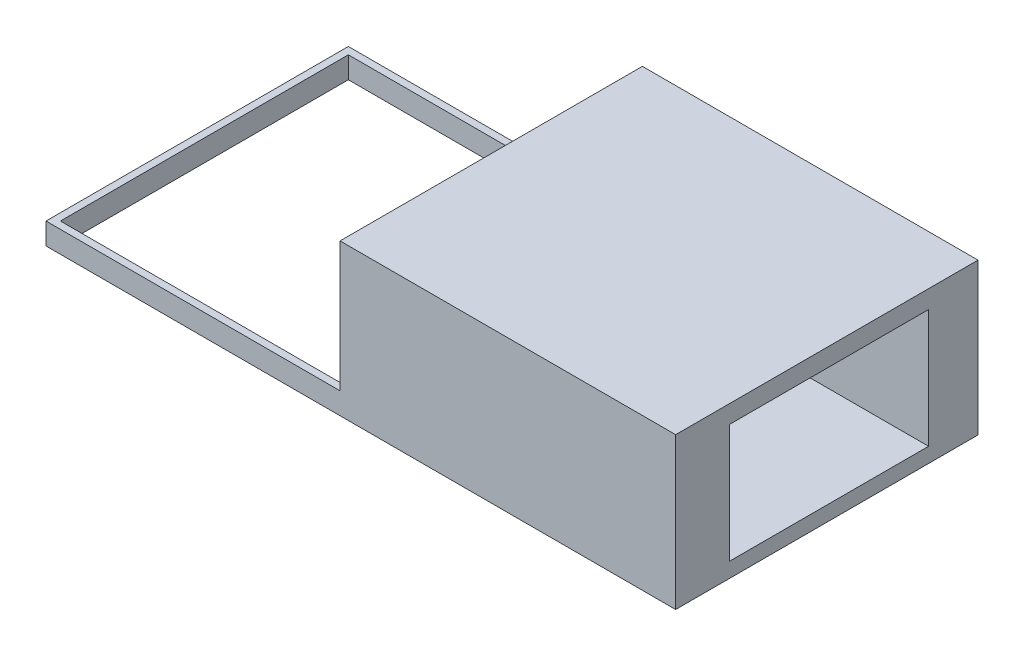
ISO-10303-21;
HEADER;
FILE_DESCRIPTION(('STEP AP214'),'2;1');
FILE_NAME('part.step','',(''),(''),'','','');
FILE_SCHEMA(('AUTOMOTIVE_DESIGN { 1 0 10303 214 1 1 1 1 }'));
ENDSEC;
DATA;
#1=APPLICATION_CONTEXT('core data for automotive mechanical design processes');
#2=APPLICATION_PROTOCOL_DEFINITION('international standard','automotive_design',2000,#1);
#3=PRODUCT_CONTEXT('',#1,'mechanical');
#4=PRODUCT('Part','Part','',(#3));
#5=PRODUCT_RELATED_PRODUCT_CATEGORY('part','',(#4));
#6=PRODUCT_DEFINITION_FORMATION('','',#4);
#7=PRODUCT_DEFINITION_CONTEXT('part definition',#1,'design');
#8=PRODUCT_DEFINITION('design','',#6,#7);
#9=PRODUCT_DEFINITION_SHAPE('','',#8);
#10=(LENGTH_UNIT() NAMED_UNIT(*) SI_UNIT(.MILLI.,.METRE.));
#11=(NAMED_UNIT(*) PLANE_ANGLE_UNIT() SI_UNIT($,.RADIAN.));
#12=(NAMED_UNIT(*) SI_UNIT($,.STERADIAN.) SOLID_ANGLE_UNIT());
#13=UNCERTAINTY_MEASURE_WITH_UNIT(LENGTH_MEASURE(1.E-05),#10,'distance_accuracy_value','');
#14=(GEOMETRIC_REPRESENTATION_CONTEXT(3) GLOBAL_UNCERTAINTY_ASSIGNED_CONTEXT((#13)) GLOBAL_UNIT_ASSIGNED_CONTEXT((#10,
#11,#12)) REPRESENTATION_CONTEXT('',''));
#15=CARTESIAN_POINT('',(0.,0.,0.));
#16=DIRECTION('',(0.,0.,1.));
#17=DIRECTION('',(1.,0.,0.));
#18=AXIS2_PLACEMENT_3D('',#15,#16,#17);
#19=CARTESIAN_POINT('',(1.,3.,3.21259146429235));
#20=DIRECTION('',(0.,0.,-1.));
#21=DIRECTION('',(-1.,0.,0.));
#22=AXIS2_PLACEMENT_3D('',#19,#20,#21);
#23=PLANE('',#22);
#24=DIRECTION('',(0.,-1.,0.));
#25=VECTOR('',#24,1.);
#26=CARTESIAN_POINT('',(42.1327943498196,21.,3.21259146429231));
#27=LINE('',#26,#25);
#28=CARTESIAN_POINT('',(42.1327943498196,19.998979773959,3.21259146429231));
#29=VERTEX_POINT('',#28);
#30=CARTESIAN_POINT('',(42.1327943498196,3.,3.21259146429231));
#31=VERTEX_POINT('',#30);
#32=EDGE_CURVE('E233',#29,#31,#27,.T.);
#33=ORIENTED_EDGE('',*,*,#32,.F.);
#34=DIRECTION('',(1.,0.,0.));
#35=VECTOR('',#34,1.);
#36=CARTESIAN_POINT('',(1.,19.998979773959,3.21259146429235));
#37=LINE('',#36,#35);
#38=CARTESIAN_POINT('',(61.3133724717392,19.998979773959,3.21259146429235));
#39=VERTEX_POINT('',#38);
#40=EDGE_CURVE('E68',#29,#39,#37,.T.);
#41=ORIENTED_EDGE('',*,*,#40,.T.);
#42=DIRECTION('',(0.,-1.,0.));
#43=VECTOR('',#42,1.);
#44=CARTESIAN_POINT('',(61.3133724717395,3.,3.21259146429235));
#45=LINE('',#44,#43);
#46=CARTESIAN_POINT('',(61.3133724717395,0.,3.21259146429235));
#47=VERTEX_POINT('',#46);
#48=EDGE_CURVE('E271',#39,#47,#45,.T.);
#49=ORIENTED_EDGE('',*,*,#48,.T.);
#50=DIRECTION('',(1.,0.,0.));
#51=VECTOR('',#50,1.);
#52=CARTESIAN_POINT('',(1.,0.,3.21259146429235));
#53=LINE('',#52,#51);
#54=CARTESIAN_POINT('',(1.,0.,3.21259146429235));
#55=VERTEX_POINT('',#54);
#56=EDGE_CURVE('E258',#55,#47,#53,.T.);
#57=ORIENTED_EDGE('',*,*,#56,.F.);
#58=DIRECTION('',(0.,-1.,0.));
#59=VECTOR('',#58,1.);
#60=CARTESIAN_POINT('',(1.,3.,3.21259146429235));
#61=LINE('',#60,#59);
#62=CARTESIAN_POINT('',(1.,3.,3.21259146429235));
#63=VERTEX_POINT('',#62);
#64=EDGE_CURVE('E273',#63,#55,#61,.T.);
#65=ORIENTED_EDGE('',*,*,#64,.F.);
#66=DIRECTION('',(1.,0.,0.));
#67=VECTOR('',#66,1.);
#68=CARTESIAN_POINT('',(1.,3.,3.21259146429235));
#69=LINE('',#68,#67);
#70=CARTESIAN_POINT('',(40.7750826506642,3.,3.21259146429235));
#71=VERTEX_POINT('',#70);
#72=EDGE_CURVE('E250',#63,#71,#69,.T.);
#73=ORIENTED_EDGE('',*,*,#72,.T.);
#74=EDGE_CURVE('E248',#71,#31,#69,.T.);
#75=ORIENTED_EDGE('',*,*,#74,.T.);
#76=EDGE_LOOP('',(#33,#41,#49,#57,#65,#73,#75));
#77=FACE_BOUND('',#76,.T.);
#78=ADVANCED_FACE('F41',(#77),#23,.T.);
#79=CARTESIAN_POINT('',(61.3133724717395,3.,3.21259146429235));
#80=DIRECTION('',(-1.,0.,0.));
#81=DIRECTION('',(0.,0.,1.));
#82=AXIS2_PLACEMENT_3D('',#79,#80,#81);
#83=PLANE('',#82);
#84=DIRECTION('',(0.,1.,0.));
#85=VECTOR('',#84,1.);
#86=CARTESIAN_POINT('',(61.3133724717395,3.,-3.27195310719408));
#87=LINE('',#86,#85);
#88=CARTESIAN_POINT('',(61.3133724717395,2.07018410298603,-3.27195310719408));
#89=VERTEX_POINT('',#88);
#90=CARTESIAN_POINT('',(61.3133724717395,18.4952524257536,-3.27195310719408));
#91=VERTEX_POINT('',#90);
#92=EDGE_CURVE('E172',#89,#91,#87,.T.);
#93=ORIENTED_EDGE('',*,*,#92,.F.);
#94=DIRECTION('',(0.,0.,1.));
#95=VECTOR('',#94,1.);
#96=CARTESIAN_POINT('',(61.3133724717395,2.07018410298603,3.21259146429235));
#97=LINE('',#96,#95);
#98=CARTESIAN_POINT('',(61.3133724717395,2.07018410298603,-30.8575560884698));
#99=VERTEX_POINT('',#98);
#100=EDGE_CURVE('E175',#99,#89,#97,.T.);
#101=ORIENTED_EDGE('',*,*,#100,.F.);
#102=DIRECTION('',(0.,-1.,0.));
#103=VECTOR('',#102,1.);
#104=CARTESIAN_POINT('',(61.3133724717395,3.,-30.8575560884698));
#105=LINE('',#104,#103);
#106=CARTESIAN_POINT('',(61.3133724717395,18.4952524257536,-30.8575560884698));
#107=VERTEX_POINT('',#106);
#108=EDGE_CURVE('E210',#107,#99,#105,.T.);
#109=ORIENTED_EDGE('',*,*,#108,.F.);
#110=DIRECTION('',(0.,0.,-1.));
#111=VECTOR('',#110,1.);
#112=CARTESIAN_POINT('',(61.3133724717395,18.4952524257536,3.21259146429235));
#113=LINE('',#112,#111);
#114=EDGE_CURVE('E212',#91,#107,#113,.T.);
#115=ORIENTED_EDGE('',*,*,#114,.F.);
#116=EDGE_LOOP('',(#93,#101,#109,#115));
#117=FACE_BOUND('',#116,.T.);
#118=ORIENTED_EDGE('',*,*,#48,.F.);
#119=DIRECTION('',(0.,0.,-1.));
#120=VECTOR('',#119,1.);
#121=CARTESIAN_POINT('',(61.3133724717392,19.998979773959,3.28784136335788));
#122=LINE('',#121,#120);
#123=CARTESIAN_POINT('',(61.3133724717392,19.998979773959,-36.7121586366421));
#124=VERTEX_POINT('',#123);
#125=EDGE_CURVE('E217',#39,#124,#122,.T.);
#126=ORIENTED_EDGE('',*,*,#125,.T.);
#127=DIRECTION('',(0.,-1.,0.));
#128=VECTOR('',#127,1.);
#129=CARTESIAN_POINT('',(61.3133724717395,3.,-36.7121586366421));
#130=LINE('',#129,#128);
#131=CARTESIAN_POINT('',(61.3133724717395,0.,-36.7121586366421));
#132=VERTEX_POINT('',#131);
#133=EDGE_CURVE('E269',#124,#132,#130,.T.);
#134=ORIENTED_EDGE('',*,*,#133,.T.);
#135=DIRECTION('',(0.,0.,-1.));
#136=VECTOR('',#135,1.);
#137=CARTESIAN_POINT('',(61.3133724717395,0.,3.21259146429235));
#138=LINE('',#137,#136);
#139=EDGE_CURVE('E261',#47,#132,#138,.T.);
#140=ORIENTED_EDGE('',*,*,#139,.F.);
#141=EDGE_LOOP('',(#118,#126,#134,#140));
#142=FACE_BOUND('',#141,.T.);
#143=ADVANCED_FACE('F338',(#117,#142),#83,.T.);
#144=CARTESIAN_POINT('',(1.,3.,-36.7121586366421));
#145=DIRECTION('',(0.,0.,1.));
#146=DIRECTION('',(1.,0.,0.));
#147=AXIS2_PLACEMENT_3D('',#144,#145,#146);
#148=PLANE('',#147);
#149=ORIENTED_EDGE('',*,*,#133,.F.);
#150=DIRECTION('',(1.,0.,0.));
#151=VECTOR('',#150,1.);
#152=CARTESIAN_POINT('',(42.1327943498191,19.998979773959,-36.7121586366421));
#153=LINE('',#152,#151);
#154=CARTESIAN_POINT('',(42.1327943498191,19.998979773959,-36.7121586366421));
#155=VERTEX_POINT('',#154);
#156=EDGE_CURVE('E215',#155,#124,#153,.T.);
#157=ORIENTED_EDGE('',*,*,#156,.F.);
#158=DIRECTION('',(0.,-1.,0.));
#159=VECTOR('',#158,1.);
#160=CARTESIAN_POINT('',(42.1327943498191,21.,-36.7121586366426));
#161=LINE('',#160,#159);
#162=CARTESIAN_POINT('',(42.1327943498191,3.,-36.7121586366426));
#163=VERTEX_POINT('',#162);
#164=EDGE_CURVE('E241',#155,#163,#161,.T.);
#165=ORIENTED_EDGE('',*,*,#164,.T.);
#166=DIRECTION('',(-1.,0.,0.));
#167=VECTOR('',#166,1.);
#168=CARTESIAN_POINT('',(1.,3.,-36.7121586366421));
#169=LINE('',#168,#167);
#170=CARTESIAN_POINT('',(40.7750826506642,3.,-36.7121586366421));
#171=VERTEX_POINT('',#170);
#172=EDGE_CURVE('E255',#163,#171,#169,.T.);
#173=ORIENTED_EDGE('',*,*,#172,.T.);
#174=CARTESIAN_POINT('',(1.,3.,-36.7121586366421));
#175=VERTEX_POINT('',#174);
#176=EDGE_CURVE('E253',#171,#175,#169,.T.);
#177=ORIENTED_EDGE('',*,*,#176,.T.);
#178=DIRECTION('',(0.,-1.,0.));
#179=VECTOR('',#178,1.);
#180=CARTESIAN_POINT('',(1.,3.,-36.7121586366421));
#181=LINE('',#180,#179);
#182=CARTESIAN_POINT('',(1.,0.,-36.7121586366421));
#183=VERTEX_POINT('',#182);
#184=EDGE_CURVE('E266',#175,#183,#181,.T.);
#185=ORIENTED_EDGE('',*,*,#184,.T.);
#186=DIRECTION('',(-1.,0.,0.));
#187=VECTOR('',#186,1.);
#188=CARTESIAN_POINT('',(1.,0.,-36.7121586366421));
#189=LINE('',#188,#187);
#190=EDGE_CURVE('E249',#132,#183,#189,.T.);
#191=ORIENTED_EDGE('',*,*,#190,.F.);
#192=EDGE_LOOP('',(#149,#157,#165,#173,#177,#185,#191));
#193=FACE_BOUND('',#192,.T.);
#194=ADVANCED_FACE('F344',(#193),#148,.T.);
#195=CARTESIAN_POINT('',(42.1327943498195,21.,-1.11022302462516E-13));
#196=DIRECTION('',(1.,0.,0.));
#197=DIRECTION('',(0.,0.,-1.));
#198=AXIS2_PLACEMENT_3D('',#195,#196,#197);
#199=PLANE('',#198);
#200=CARTESIAN_POINT('',(42.1327943498195,11.5423877708466,-17.2425113434991));
#201=DIRECTION('',(1.,0.,0.));
#202=DIRECTION('',(0.,0.,-1.));
#203=AXIS2_PLACEMENT_3D('',#200,#201,#202);
#204=CIRCLE('',#203,2.49999999999999);
#205=CARTESIAN_POINT('',(42.1327943498195,11.5423877708466,-19.7425113434991));
#206=VERTEX_POINT('',#205);
#207=EDGE_CURVE('E45',#206,#206,#204,.T.);
#208=ORIENTED_EDGE('',*,*,#207,.F.);
#209=EDGE_LOOP('',(#208));
#210=FACE_BOUND('',#209,.T.);
#211=ORIENTED_EDGE('',*,*,#164,.F.);
#212=DIRECTION('',(0.,0.,-1.));
#213=VECTOR('',#212,1.);
#214=CARTESIAN_POINT('',(42.1327943498191,19.998979773959,3.28784136335788));
#215=LINE('',#214,#213);
#216=EDGE_CURVE('E220',#29,#155,#215,.T.);
#217=ORIENTED_EDGE('',*,*,#216,.F.);
#218=ORIENTED_EDGE('',*,*,#32,.T.);
#219=DIRECTION('',(0.,0.,1.));
#220=VECTOR('',#219,1.);
#221=CARTESIAN_POINT('',(42.1327943498195,3.,-1.11022302462516E-13));
#222=LINE('',#221,#220);
#223=EDGE_CURVE('E234',#163,#31,#222,.T.);
#224=ORIENTED_EDGE('',*,*,#223,.F.);
#225=EDGE_LOOP('',(#211,#217,#218,#224));
#226=FACE_BOUND('',#225,.T.);
#227=ADVANCED_FACE('F351',(#210,#226),#199,.T.);
#228=CARTESIAN_POINT('',(0.,3.,0.));
#229=DIRECTION('',(0.,-1.,0.));
#230=DIRECTION('',(0.,0.,-1.));
#231=AXIS2_PLACEMENT_3D('',#228,#229,#230);
#232=PLANE('',#231);
#233=DIRECTION('',(1.,0.,0.));
#234=VECTOR('',#233,1.);
#235=CARTESIAN_POINT('',(0.,3.,4.21259146429235));
#236=LINE('',#235,#234);
#237=CARTESIAN_POINT('',(0.,3.,4.21259146429235));
#238=VERTEX_POINT('',#237);
#239=CARTESIAN_POINT('',(40.7750826506644,3.,4.21259146429231));
#240=VERTEX_POINT('',#239);
#241=EDGE_CURVE('E280',#238,#240,#236,.T.);
#242=ORIENTED_EDGE('',*,*,#241,.T.);
#243=DIRECTION('',(0.,0.,-1.));
#244=VECTOR('',#243,1.);
#245=CARTESIAN_POINT('',(40.7750826506642,3.,-2.22044604925031E-13));
#246=LINE('',#245,#244);
#247=EDGE_CURVE('E52',#240,#71,#246,.T.);
#248=ORIENTED_EDGE('',*,*,#247,.T.);
#249=ORIENTED_EDGE('',*,*,#72,.F.);
#250=DIRECTION('',(0.,0.,1.));
#251=VECTOR('',#250,1.);
#252=CARTESIAN_POINT('',(1.,3.,3.21259146429235));
#253=LINE('',#252,#251);
#254=EDGE_CURVE('E246',#175,#63,#253,.T.);
#255=ORIENTED_EDGE('',*,*,#254,.F.);
#256=ORIENTED_EDGE('',*,*,#176,.F.);
#257=CARTESIAN_POINT('',(40.7750826506644,3.,-37.7121586366421));
#258=VERTEX_POINT('',#257);
#259=EDGE_CURVE('E11',#171,#258,#246,.T.);
#260=ORIENTED_EDGE('',*,*,#259,.T.);
#261=DIRECTION('',(-1.,0.,0.));
#262=VECTOR('',#261,1.);
#263=CARTESIAN_POINT('',(0.,3.,-37.7121586366421));
#264=LINE('',#263,#262);
#265=CARTESIAN_POINT('',(0.,3.,-37.7121586366421));
#266=VERTEX_POINT('',#265);
#267=EDGE_CURVE('E284',#258,#266,#264,.T.);
#268=ORIENTED_EDGE('',*,*,#267,.T.);
#269=DIRECTION('',(0.,0.,1.));
#270=VECTOR('',#269,1.);
#271=CARTESIAN_POINT('',(0.,3.,4.21259146429235));
#272=LINE('',#271,#270);
#273=EDGE_CURVE('E277',#266,#238,#272,.T.);
#274=ORIENTED_EDGE('',*,*,#273,.T.);
#275=EDGE_LOOP('',(#242,#248,#249,#255,#256,#260,#268,#274));
#276=FACE_BOUND('',#275,.T.);
#277=ADVANCED_FACE('F321',(#276),#232,.F.);
#278=CARTESIAN_POINT('',(0.,0.,0.));
#279=DIRECTION('',(0.,-1.,0.));
#280=DIRECTION('',(0.,0.,-1.));
#281=AXIS2_PLACEMENT_3D('',#278,#279,#280);
#282=PLANE('',#281);
#283=DIRECTION('',(0.,0.,1.));
#284=VECTOR('',#283,1.);
#285=CARTESIAN_POINT('',(0.,0.,4.21259146429235));
#286=LINE('',#285,#284);
#287=CARTESIAN_POINT('',(0.,0.,-37.7121586366421));
#288=VERTEX_POINT('',#287);
#289=CARTESIAN_POINT('',(0.,0.,4.21259146429235));
#290=VERTEX_POINT('',#289);
#291=EDGE_CURVE('E276',#288,#290,#286,.T.);
#292=ORIENTED_EDGE('',*,*,#291,.F.);
#293=DIRECTION('',(-1.,0.,0.));
#294=VECTOR('',#293,1.);
#295=CARTESIAN_POINT('',(0.,0.,-37.7121586366421));
#296=LINE('',#295,#294);
#297=CARTESIAN_POINT('',(87.3133724717395,0.,-37.7121586366421));
#298=VERTEX_POINT('',#297);
#299=EDGE_CURVE('E281',#298,#288,#296,.T.);
#300=ORIENTED_EDGE('',*,*,#299,.F.);
#301=DIRECTION('',(0.,0.,-1.));
#302=VECTOR('',#301,1.);
#303=CARTESIAN_POINT('',(87.3133724717395,0.,-37.7121586366421));
#304=LINE('',#303,#302);
#305=CARTESIAN_POINT('',(87.3133724717395,0.,4.21259146429235));
#306=VERTEX_POINT('',#305);
#307=EDGE_CURVE('E196',#306,#298,#304,.T.);
#308=ORIENTED_EDGE('',*,*,#307,.F.);
#309=DIRECTION('',(1.,0.,0.));
#310=VECTOR('',#309,1.);
#311=CARTESIAN_POINT('',(0.,0.,4.21259146429235));
#312=LINE('',#311,#310);
#313=EDGE_CURVE('E289',#290,#306,#312,.T.);
#314=ORIENTED_EDGE('',*,*,#313,.F.);
#315=EDGE_LOOP('',(#292,#300,#308,#314));
#316=FACE_BOUND('',#315,.T.);
#317=ORIENTED_EDGE('',*,*,#190,.T.);
#318=DIRECTION('',(0.,0.,1.));
#319=VECTOR('',#318,1.);
#320=CARTESIAN_POINT('',(1.,0.,3.21259146429235));
#321=LINE('',#320,#319);
#322=EDGE_CURVE('E243',#183,#55,#321,.T.);
#323=ORIENTED_EDGE('',*,*,#322,.T.);
#324=ORIENTED_EDGE('',*,*,#56,.T.);
#325=ORIENTED_EDGE('',*,*,#139,.T.);
#326=EDGE_LOOP('',(#317,#323,#324,#325));
#327=FACE_BOUND('',#326,.T.);
#328=ADVANCED_FACE('F304',(#316,#327),#282,.T.);
#329=CARTESIAN_POINT('',(0.,3.,4.21259146429235));
#330=DIRECTION('',(1.,0.,0.));
#331=DIRECTION('',(0.,0.,-1.));
#332=AXIS2_PLACEMENT_3D('',#329,#330,#331);
#333=PLANE('',#332);
#334=ORIENTED_EDGE('',*,*,#291,.T.);
#335=DIRECTION('',(0.,-1.,0.));
#336=VECTOR('',#335,1.);
#337=CARTESIAN_POINT('',(0.,3.,4.21259146429235));
#338=LINE('',#337,#336);
#339=EDGE_CURVE('E50',#238,#290,#338,.T.);
#340=ORIENTED_EDGE('',*,*,#339,.F.);
#341=ORIENTED_EDGE('',*,*,#273,.F.);
#342=DIRECTION('',(0.,-1.,0.));
#343=VECTOR('',#342,1.);
#344=CARTESIAN_POINT('',(0.,3.,-37.7121586366421));
#345=LINE('',#344,#343);
#346=EDGE_CURVE('E286',#266,#288,#345,.T.);
#347=ORIENTED_EDGE('',*,*,#346,.T.);
#348=EDGE_LOOP('',(#334,#340,#341,#347));
#349=FACE_BOUND('',#348,.T.);
#350=ADVANCED_FACE('F43',(#349),#333,.F.);
#351=CARTESIAN_POINT('',(0.,3.,4.21259146429235));
#352=DIRECTION('',(0.,0.,-1.));
#353=DIRECTION('',(-1.,0.,0.));
#354=AXIS2_PLACEMENT_3D('',#351,#352,#353);
#355=PLANE('',#354);
#356=ORIENTED_EDGE('',*,*,#313,.T.);
#357=DIRECTION('',(0.,-1.,0.));
#358=VECTOR('',#357,1.);
#359=CARTESIAN_POINT('',(87.3133724717395,0.,4.21259146429235));
#360=LINE('',#359,#358);
#361=CARTESIAN_POINT('',(87.3133724717395,21.,4.21259146429209));
#362=VERTEX_POINT('',#361);
#363=EDGE_CURVE('E193',#362,#306,#360,.T.);
#364=ORIENTED_EDGE('',*,*,#363,.F.);
#365=DIRECTION('',(1.,0.,0.));
#366=VECTOR('',#365,1.);
#367=CARTESIAN_POINT('',(0.,21.,4.21259146429231));
#368=LINE('',#367,#366);
#369=CARTESIAN_POINT('',(40.7750826506644,21.,4.21259146429231));
#370=VERTEX_POINT('',#369);
#371=EDGE_CURVE('E231',#370,#362,#368,.T.);
#372=ORIENTED_EDGE('',*,*,#371,.F.);
#373=DIRECTION('',(0.,-1.,0.));
#374=VECTOR('',#373,1.);
#375=CARTESIAN_POINT('',(40.7750826506644,21.,4.21259146429231));
#376=LINE('',#375,#374);
#377=EDGE_CURVE('E238',#370,#240,#376,.T.);
#378=ORIENTED_EDGE('',*,*,#377,.T.);
#379=ORIENTED_EDGE('',*,*,#241,.F.);
#380=ORIENTED_EDGE('',*,*,#339,.T.);
#381=EDGE_LOOP('',(#356,#364,#372,#378,#379,#380));
#382=FACE_BOUND('',#381,.T.);
#383=ADVANCED_FACE('F296',(#382),#355,.F.);
#384=CARTESIAN_POINT('',(0.,3.,-37.7121586366421));
#385=DIRECTION('',(0.,0.,1.));
#386=DIRECTION('',(1.,0.,0.));
#387=AXIS2_PLACEMENT_3D('',#384,#385,#386);
#388=PLANE('',#387);
#389=ORIENTED_EDGE('',*,*,#299,.T.);
#390=ORIENTED_EDGE('',*,*,#346,.F.);
#391=ORIENTED_EDGE('',*,*,#267,.F.);
#392=DIRECTION('',(0.,-1.,0.));
#393=VECTOR('',#392,1.);
#394=CARTESIAN_POINT('',(40.7750826506644,21.,-37.7121586366422));
#395=LINE('',#394,#393);
#396=CARTESIAN_POINT('',(40.7750826506644,21.,-37.7121586366422));
#397=VERTEX_POINT('',#396);
#398=EDGE_CURVE('E240',#397,#258,#395,.T.);
#399=ORIENTED_EDGE('',*,*,#398,.F.);
#400=DIRECTION('',(-1.,0.,0.));
#401=VECTOR('',#400,1.);
#402=CARTESIAN_POINT('',(-2.77555756156289E-13,21.,-37.7121586366425));
#403=LINE('',#402,#401);
#404=CARTESIAN_POINT('',(87.3133724717395,21.,-37.7121586366422));
#405=VERTEX_POINT('',#404);
#406=EDGE_CURVE('E226',#405,#397,#403,.T.);
#407=ORIENTED_EDGE('',*,*,#406,.F.);
#408=DIRECTION('',(0.,1.,0.));
#409=VECTOR('',#408,1.);
#410=CARTESIAN_POINT('',(87.3133724717395,21.,-37.7121586366422));
#411=LINE('',#410,#409);
#412=EDGE_CURVE('E199',#298,#405,#411,.T.);
#413=ORIENTED_EDGE('',*,*,#412,.F.);
#414=EDGE_LOOP('',(#389,#390,#391,#399,#407,#413));
#415=FACE_BOUND('',#414,.T.);
#416=ADVANCED_FACE('F325',(#415),#388,.F.);
#417=CARTESIAN_POINT('',(1.,3.,3.21259146429235));
#418=DIRECTION('',(1.,0.,0.));
#419=DIRECTION('',(0.,0.,-1.));
#420=AXIS2_PLACEMENT_3D('',#417,#418,#419);
#421=PLANE('',#420);
#422=ORIENTED_EDGE('',*,*,#322,.F.);
#423=ORIENTED_EDGE('',*,*,#184,.F.);
#424=ORIENTED_EDGE('',*,*,#254,.T.);
#425=ORIENTED_EDGE('',*,*,#64,.T.);
#426=EDGE_LOOP('',(#422,#423,#424,#425));
#427=FACE_BOUND('',#426,.T.);
#428=ADVANCED_FACE('F327',(#427),#421,.T.);
#429=CARTESIAN_POINT('',(40.7750826506642,21.,-2.22044604925031E-13));
#430=DIRECTION('',(-1.,0.,0.));
#431=DIRECTION('',(0.,0.,1.));
#432=AXIS2_PLACEMENT_3D('',#429,#430,#431);
#433=PLANE('',#432);
#434=CARTESIAN_POINT('',(40.7750826506642,11.5423877708466,-17.2425113434991));
#435=DIRECTION('',(-1.,0.,0.));
#436=DIRECTION('',(0.,0.,1.));
#437=AXIS2_PLACEMENT_3D('',#434,#435,#436);
#438=CIRCLE('',#437,2.49999999999999);
#439=CARTESIAN_POINT('',(40.7750826506642,11.5423877708466,-14.7425113434991));
#440=VERTEX_POINT('',#439);
#441=EDGE_CURVE('E223',#440,#440,#438,.T.);
#442=ORIENTED_EDGE('',*,*,#441,.F.);
#443=EDGE_LOOP('',(#442));
#444=FACE_BOUND('',#443,.T.);
#445=ORIENTED_EDGE('',*,*,#247,.F.);
#446=ORIENTED_EDGE('',*,*,#377,.F.);
#447=DIRECTION('',(0.,0.,-1.));
#448=VECTOR('',#447,1.);
#449=CARTESIAN_POINT('',(40.7750826506642,21.,-2.22044604925031E-13));
#450=LINE('',#449,#448);
#451=EDGE_CURVE('E228',#370,#397,#450,.T.);
#452=ORIENTED_EDGE('',*,*,#451,.T.);
#453=ORIENTED_EDGE('',*,*,#398,.T.);
#454=ORIENTED_EDGE('',*,*,#259,.F.);
#455=EDGE_CURVE('E53',#71,#171,#246,.T.);
#456=ORIENTED_EDGE('',*,*,#455,.F.);
#457=EDGE_LOOP('',(#445,#446,#452,#453,#454,#456));
#458=FACE_BOUND('',#457,.T.);
#459=ADVANCED_FACE('F316',(#444,#458),#433,.T.);
#460=CARTESIAN_POINT('',(0.,21.,0.));
#461=DIRECTION('',(0.,1.,0.));
#462=DIRECTION('',(0.,0.,1.));
#463=AXIS2_PLACEMENT_3D('',#460,#461,#462);
#464=PLANE('',#463);
#465=ORIENTED_EDGE('',*,*,#371,.T.);
#466=DIRECTION('',(0.,0.,1.));
#467=VECTOR('',#466,1.);
#468=CARTESIAN_POINT('',(87.3133724717395,21.,4.21259146429209));
#469=LINE('',#468,#467);
#470=EDGE_CURVE('E202',#405,#362,#469,.T.);
#471=ORIENTED_EDGE('',*,*,#470,.F.);
#472=ORIENTED_EDGE('',*,*,#406,.T.);
#473=ORIENTED_EDGE('',*,*,#451,.F.);
#474=EDGE_LOOP('',(#465,#471,#472,#473));
#475=FACE_BOUND('',#474,.T.);
#476=ADVANCED_FACE('F313',(#475),#464,.T.);
#477=CARTESIAN_POINT('',(0.,3.,0.));
#478=DIRECTION('',(0.,1.,0.));
#479=DIRECTION('',(0.,0.,1.));
#480=AXIS2_PLACEMENT_3D('',#477,#478,#479);
#481=PLANE('',#480);
#482=ORIENTED_EDGE('',*,*,#172,.F.);
#483=ORIENTED_EDGE('',*,*,#223,.T.);
#484=ORIENTED_EDGE('',*,*,#74,.F.);
#485=ORIENTED_EDGE('',*,*,#455,.T.);
#486=EDGE_LOOP('',(#482,#483,#484,#485));
#487=FACE_BOUND('',#486,.T.);
#488=ADVANCED_FACE('F375',(#487),#481,.F.);
#489=CARTESIAN_POINT('',(62.3133724717395,11.5423877708466,-17.2425113434991));
#490=DIRECTION('',(-1.,0.,0.));
#491=DIRECTION('',(0.,0.,1.));
#492=AXIS2_PLACEMENT_3D('',#489,#490,#491);
#493=CYLINDRICAL_SURFACE('',#492,2.49999999999999);
#494=ORIENTED_EDGE('',*,*,#207,.T.);
#495=EDGE_LOOP('',(#494));
#496=FACE_BOUND('',#495,.T.);
#497=ORIENTED_EDGE('',*,*,#441,.T.);
#498=EDGE_LOOP('',(#497));
#499=FACE_BOUND('',#498,.T.);
#500=ADVANCED_FACE('F380',(#496,#499),#493,.F.);
#501=CARTESIAN_POINT('',(42.1327943498191,19.998979773959,3.28784136335788));
#502=DIRECTION('',(0.,1.,0.));
#503=DIRECTION('',(0.,0.,1.));
#504=AXIS2_PLACEMENT_3D('',#501,#502,#503);
#505=PLANE('',#504);
#506=ORIENTED_EDGE('',*,*,#40,.F.);
#507=ORIENTED_EDGE('',*,*,#216,.T.);
#508=ORIENTED_EDGE('',*,*,#156,.T.);
#509=ORIENTED_EDGE('',*,*,#125,.F.);
#510=EDGE_LOOP('',(#506,#507,#508,#509));
#511=FACE_BOUND('',#510,.T.);
#512=ADVANCED_FACE('F402',(#511),#505,.F.);
#513=CARTESIAN_POINT('',(57.3133724717395,18.4952524257536,-3.27195310719408));
#514=DIRECTION('',(0.,0.,1.));
#515=DIRECTION('',(0.,-1.,0.));
#516=AXIS2_PLACEMENT_3D('',#513,#514,#515);
#517=PLANE('',#516);
#518=ORIENTED_EDGE('',*,*,#92,.T.);
#519=DIRECTION('',(1.,0.,0.));
#520=VECTOR('',#519,1.);
#521=CARTESIAN_POINT('',(57.3133724717395,18.4952524257536,-3.27195310719408));
#522=LINE('',#521,#520);
#523=CARTESIAN_POINT('',(87.3133724717395,18.4952524257536,-3.27195310719408));
#524=VERTEX_POINT('',#523);
#525=EDGE_CURVE('E164',#91,#524,#522,.T.);
#526=ORIENTED_EDGE('',*,*,#525,.T.);
#527=DIRECTION('',(0.,-1.,0.));
#528=VECTOR('',#527,1.);
#529=CARTESIAN_POINT('',(87.3133724717395,18.4952524257536,-3.27195310719408));
#530=LINE('',#529,#528);
#531=CARTESIAN_POINT('',(87.3133724717395,2.07018410298603,-3.27195310719408));
#532=VERTEX_POINT('',#531);
#533=EDGE_CURVE('E169',#524,#532,#530,.T.);
#534=ORIENTED_EDGE('',*,*,#533,.T.);
#535=DIRECTION('',(1.,0.,0.));
#536=VECTOR('',#535,1.);
#537=CARTESIAN_POINT('',(57.3133724717395,2.07018410298603,-3.27195310719408));
#538=LINE('',#537,#536);
#539=EDGE_CURVE('E204',#89,#532,#538,.T.);
#540=ORIENTED_EDGE('',*,*,#539,.F.);
#541=EDGE_LOOP('',(#518,#526,#534,#540));
#542=FACE_BOUND('',#541,.T.);
#543=ADVANCED_FACE('F166',(#542),#517,.F.);
#544=CARTESIAN_POINT('',(57.3133724717395,18.4952524257536,-3.27195310719408));
#545=DIRECTION('',(0.,1.,0.));
#546=DIRECTION('',(0.,0.,1.));
#547=AXIS2_PLACEMENT_3D('',#544,#545,#546);
#548=PLANE('',#547);
#549=ORIENTED_EDGE('',*,*,#114,.T.);
#550=DIRECTION('',(1.,0.,0.));
#551=VECTOR('',#550,1.);
#552=CARTESIAN_POINT('',(57.3133724717395,18.4952524257536,-30.8575560884698));
#553=LINE('',#552,#551);
#554=CARTESIAN_POINT('',(87.3133724717395,18.4952524257536,-30.8575560884698));
#555=VERTEX_POINT('',#554);
#556=EDGE_CURVE('E176',#107,#555,#553,.T.);
#557=ORIENTED_EDGE('',*,*,#556,.T.);
#558=DIRECTION('',(0.,0.,1.));
#559=VECTOR('',#558,1.);
#560=CARTESIAN_POINT('',(87.3133724717395,18.4952524257536,-30.8575560884698));
#561=LINE('',#560,#559);
#562=EDGE_CURVE('E179',#555,#524,#561,.T.);
#563=ORIENTED_EDGE('',*,*,#562,.T.);
#564=ORIENTED_EDGE('',*,*,#525,.F.);
#565=EDGE_LOOP('',(#549,#557,#563,#564));
#566=FACE_BOUND('',#565,.T.);
#567=ADVANCED_FACE('F180',(#566),#548,.F.);
#568=CARTESIAN_POINT('',(57.3133724717395,18.4952524257536,-30.8575560884698));
#569=DIRECTION('',(0.,0.,-1.));
#570=DIRECTION('',(-1.,0.,0.));
#571=AXIS2_PLACEMENT_3D('',#568,#569,#570);
#572=PLANE('',#571);
#573=ORIENTED_EDGE('',*,*,#108,.T.);
#574=DIRECTION('',(1.,0.,0.));
#575=VECTOR('',#574,1.);
#576=CARTESIAN_POINT('',(57.3133724717395,2.07018410298603,-30.8575560884698));
#577=LINE('',#576,#575);
#578=CARTESIAN_POINT('',(87.3133724717395,2.07018410298603,-30.8575560884698));
#579=VERTEX_POINT('',#578);
#580=EDGE_CURVE('E60',#99,#579,#577,.T.);
#581=ORIENTED_EDGE('',*,*,#580,.T.);
#582=DIRECTION('',(0.,1.,0.));
#583=VECTOR('',#582,1.);
#584=CARTESIAN_POINT('',(87.3133724717395,2.07018410298603,-30.8575560884698));
#585=LINE('',#584,#583);
#586=EDGE_CURVE('E189',#579,#555,#585,.T.);
#587=ORIENTED_EDGE('',*,*,#586,.T.);
#588=ORIENTED_EDGE('',*,*,#556,.F.);
#589=EDGE_LOOP('',(#573,#581,#587,#588));
#590=FACE_BOUND('',#589,.T.);
#591=ADVANCED_FACE('F483',(#590),#572,.F.);
#592=CARTESIAN_POINT('',(57.3133724717395,2.07018410298603,-3.27195310719408));
#593=DIRECTION('',(0.,-1.,0.));
#594=DIRECTION('',(0.,0.,-1.));
#595=AXIS2_PLACEMENT_3D('',#592,#593,#594);
#596=PLANE('',#595);
#597=ORIENTED_EDGE('',*,*,#100,.T.);
#598=ORIENTED_EDGE('',*,*,#539,.T.);
#599=DIRECTION('',(0.,0.,-1.));
#600=VECTOR('',#599,1.);
#601=CARTESIAN_POINT('',(87.3133724717395,2.07018410298603,-3.27195310719408));
#602=LINE('',#601,#600);
#603=EDGE_CURVE('E187',#532,#579,#602,.T.);
#604=ORIENTED_EDGE('',*,*,#603,.T.);
#605=ORIENTED_EDGE('',*,*,#580,.F.);
#606=EDGE_LOOP('',(#597,#598,#604,#605));
#607=FACE_BOUND('',#606,.T.);
#608=ADVANCED_FACE('F493',(#607),#596,.F.);
#609=CARTESIAN_POINT('',(87.3133724717395,0.,0.));
#610=DIRECTION('',(-1.,0.,0.));
#611=DIRECTION('',(0.,0.,1.));
#612=AXIS2_PLACEMENT_3D('',#609,#610,#611);
#613=PLANE('',#612);
#614=ORIENTED_EDGE('',*,*,#363,.T.);
#615=ORIENTED_EDGE('',*,*,#307,.T.);
#616=ORIENTED_EDGE('',*,*,#412,.T.);
#617=ORIENTED_EDGE('',*,*,#470,.T.);
#618=EDGE_LOOP('',(#614,#615,#616,#617));
#619=FACE_BOUND('',#618,.T.);
#620=ORIENTED_EDGE('',*,*,#562,.F.);
#621=ORIENTED_EDGE('',*,*,#586,.F.);
#622=ORIENTED_EDGE('',*,*,#603,.F.);
#623=ORIENTED_EDGE('',*,*,#533,.F.);
#624=EDGE_LOOP('',(#620,#621,#622,#623));
#625=FACE_BOUND('',#624,.T.);
#626=ADVANCED_FACE('F186',(#619,#625),#613,.F.);
#627=CLOSED_SHELL('',(#78,#143,#194,#227,#277,#328,#350,#383,#416,#428,#459,#476,#488,#500,#512,
#543,#567,#591,#608,#626));
#628=MANIFOLD_SOLID_BREP('B2',#627);
#629=ADVANCED_BREP_SHAPE_REPRESENTATION('',(#18,#628),#14);
#630=SHAPE_DEFINITION_REPRESENTATION(#9,#629);
ENDSEC;
END-ISO-10303-21;
